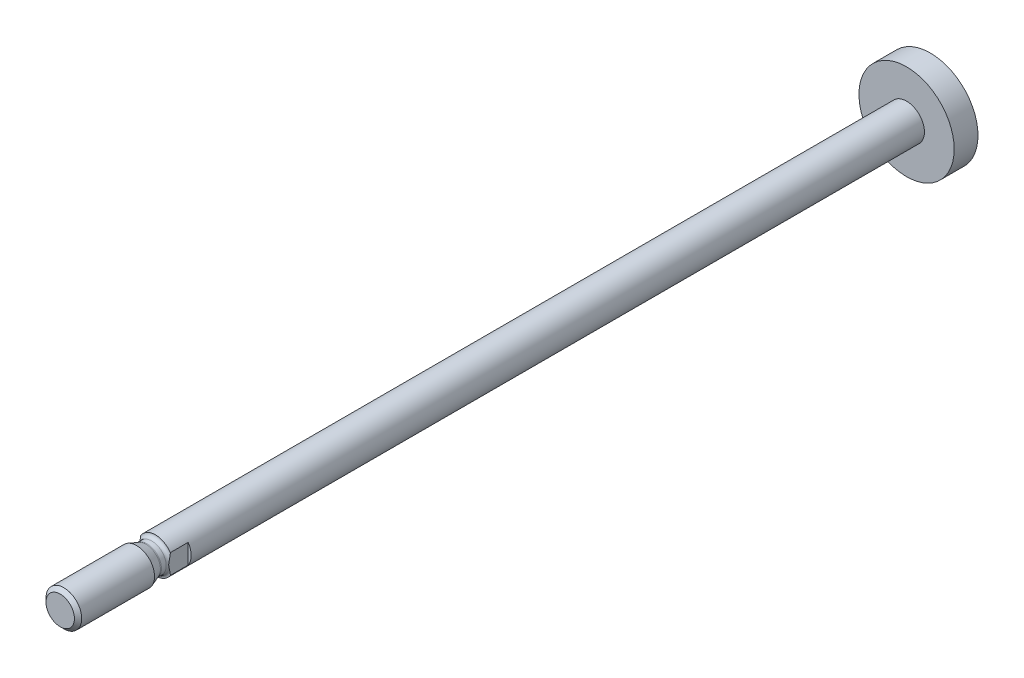
ISO-10303-21;
HEADER;
FILE_DESCRIPTION(('STEP AP214'),'2;1');
FILE_NAME('part.step','',(''),(''),'','','');
FILE_SCHEMA(('AUTOMOTIVE_DESIGN { 1 0 10303 214 1 1 1 1 }'));
ENDSEC;
DATA;
#1=APPLICATION_CONTEXT('core data for automotive mechanical design processes');
#2=APPLICATION_PROTOCOL_DEFINITION('international standard','automotive_design',2000,#1);
#3=PRODUCT_CONTEXT('',#1,'mechanical');
#4=PRODUCT('Part','Part','',(#3));
#5=PRODUCT_RELATED_PRODUCT_CATEGORY('part','',(#4));
#6=PRODUCT_DEFINITION_FORMATION('','',#4);
#7=PRODUCT_DEFINITION_CONTEXT('part definition',#1,'design');
#8=PRODUCT_DEFINITION('design','',#6,#7);
#9=PRODUCT_DEFINITION_SHAPE('','',#8);
#10=(LENGTH_UNIT() NAMED_UNIT(*) SI_UNIT(.MILLI.,.METRE.));
#11=(NAMED_UNIT(*) PLANE_ANGLE_UNIT() SI_UNIT($,.RADIAN.));
#12=(NAMED_UNIT(*) SI_UNIT($,.STERADIAN.) SOLID_ANGLE_UNIT());
#13=UNCERTAINTY_MEASURE_WITH_UNIT(LENGTH_MEASURE(1.E-05),#10,'distance_accuracy_value','');
#14=(GEOMETRIC_REPRESENTATION_CONTEXT(3) GLOBAL_UNCERTAINTY_ASSIGNED_CONTEXT((#13)) GLOBAL_UNIT_ASSIGNED_CONTEXT((#10,
#11,#12)) REPRESENTATION_CONTEXT('',''));
#15=CARTESIAN_POINT('',(0.,0.,0.));
#16=DIRECTION('',(0.,0.,1.));
#17=DIRECTION('',(1.,0.,0.));
#18=AXIS2_PLACEMENT_3D('',#15,#16,#17);
#19=CARTESIAN_POINT('',(0.,0.,-125.2));
#20=DIRECTION('',(0.,0.,1.));
#21=DIRECTION('',(1.,0.,0.));
#22=AXIS2_PLACEMENT_3D('',#19,#20,#21);
#23=CYLINDRICAL_SURFACE('',#22,3.);
#24=CARTESIAN_POINT('',(0.,0.,-121.2));
#25=DIRECTION('',(0.,0.,1.));
#26=DIRECTION('',(1.,0.,0.));
#27=AXIS2_PLACEMENT_3D('',#24,#25,#26);
#28=CIRCLE('',#27,3.);
#29=CARTESIAN_POINT('',(3.,0.,-121.2));
#30=VERTEX_POINT('',#29);
#31=EDGE_CURVE('E123',#30,#30,#28,.T.);
#32=ORIENTED_EDGE('',*,*,#31,.T.);
#33=EDGE_LOOP('',(#32));
#34=FACE_BOUND('',#33,.T.);
#35=DIRECTION('',(0.,0.,1.));
#36=VECTOR('',#35,1.);
#37=CARTESIAN_POINT('',(-2.5,-1.6583123951777,-125.2));
#38=LINE('',#37,#36);
#39=CARTESIAN_POINT('',(-2.5,-1.6583123951777,2.));
#40=VERTEX_POINT('',#39);
#41=CARTESIAN_POINT('',(-2.5,-1.6583123951777,5.));
#42=VERTEX_POINT('',#41);
#43=EDGE_CURVE('E53',#40,#42,#38,.T.);
#44=ORIENTED_EDGE('',*,*,#43,.F.);
#45=CARTESIAN_POINT('',(0.,0.,2.));
#46=DIRECTION('',(0.,0.,1.));
#47=DIRECTION('',(1.,0.,0.));
#48=AXIS2_PLACEMENT_3D('',#45,#46,#47);
#49=CIRCLE('',#48,3.);
#50=CARTESIAN_POINT('',(-2.5,1.6583123951777,2.));
#51=VERTEX_POINT('',#50);
#52=EDGE_CURVE('E11',#51,#40,#49,.T.);
#53=ORIENTED_EDGE('',*,*,#52,.F.);
#54=DIRECTION('',(0.,0.,1.));
#55=VECTOR('',#54,1.);
#56=CARTESIAN_POINT('',(-2.5,1.6583123951777,-125.2));
#57=LINE('',#56,#55);
#58=CARTESIAN_POINT('',(-2.5,1.65831239517778,4.99999999999909));
#59=VERTEX_POINT('',#58);
#60=EDGE_CURVE('E93',#59,#51,#57,.F.);
#61=ORIENTED_EDGE('',*,*,#60,.F.);
#62=CARTESIAN_POINT('',(0.,0.,5.));
#63=DIRECTION('',(0.,0.,1.));
#64=DIRECTION('',(1.,0.,0.));
#65=AXIS2_PLACEMENT_3D('',#62,#63,#64);
#66=CIRCLE('',#65,3.);
#67=CARTESIAN_POINT('',(2.5,1.6583123951777,5.));
#68=VERTEX_POINT('',#67);
#69=EDGE_CURVE('E92',#68,#59,#66,.T.);
#70=ORIENTED_EDGE('',*,*,#69,.F.);
#71=DIRECTION('',(0.,0.,1.));
#72=VECTOR('',#71,1.);
#73=CARTESIAN_POINT('',(2.5,1.6583123951777,-125.2));
#74=LINE('',#73,#72);
#75=CARTESIAN_POINT('',(2.5,1.6583123951777,2.));
#76=VERTEX_POINT('',#75);
#77=EDGE_CURVE('E61',#76,#68,#74,.T.);
#78=ORIENTED_EDGE('',*,*,#77,.F.);
#79=CARTESIAN_POINT('',(2.5,-1.6583123951777,2.));
#80=VERTEX_POINT('',#79);
#81=EDGE_CURVE('E42',#80,#76,#49,.T.);
#82=ORIENTED_EDGE('',*,*,#81,.F.);
#83=DIRECTION('',(0.,0.,1.));
#84=VECTOR('',#83,1.);
#85=CARTESIAN_POINT('',(2.5,-1.6583123951777,-125.2));
#86=LINE('',#85,#84);
#87=CARTESIAN_POINT('',(2.5,-1.65831239517778,4.99999999999909));
#88=VERTEX_POINT('',#87);
#89=EDGE_CURVE('E86',#88,#80,#86,.F.);
#90=ORIENTED_EDGE('',*,*,#89,.F.);
#91=EDGE_CURVE('E126',#42,#88,#66,.T.);
#92=ORIENTED_EDGE('',*,*,#91,.F.);
#93=EDGE_LOOP('',(#44,#53,#61,#70,#78,#82,#90,#92));
#94=FACE_BOUND('',#93,.T.);
#95=ADVANCED_FACE('F39',(#34,#94),#23,.T.);
#96=CARTESIAN_POINT('',(0.,0.,5.6000000000001));
#97=DIRECTION('',(0.,0.,1.));
#98=DIRECTION('',(1.,0.,0.));
#99=AXIS2_PLACEMENT_3D('',#96,#97,#98);
#100=TOROIDAL_SURFACE('',#99,3.0000000000001,0.600000000000099);
#101=CARTESIAN_POINT('',(0.,0.,5.6));
#102=DIRECTION('',(0.,0.,1.));
#103=DIRECTION('',(1.,0.,0.));
#104=AXIS2_PLACEMENT_3D('',#101,#102,#103);
#105=CIRCLE('',#104,2.4);
#106=CARTESIAN_POINT('',(2.4,0.,5.6));
#107=VERTEX_POINT('',#106);
#108=EDGE_CURVE('E114',#107,#107,#105,.T.);
#109=ORIENTED_EDGE('',*,*,#108,.F.);
#110=EDGE_LOOP('',(#109));
#111=FACE_BOUND('',#110,.T.);
#112=CARTESIAN_POINT('',(-2.5,0.,5.26833752096453));
#113=CARTESIAN_POINT('',(-2.5,0.0507234426297441,5.26834839993848));
#114=CARTESIAN_POINT('',(-2.5,0.101441776799662,5.26596843791489));
#115=CARTESIAN_POINT('',(-2.5,0.202536067556288,5.2569952015163));
#116=CARTESIAN_POINT('',(-2.5,0.252911588949165,5.2503973212644));
#117=CARTESIAN_POINT('',(-2.5,0.35392632203634,5.23403658213965));
#118=CARTESIAN_POINT('',(-2.5,0.404557369480025,5.224225913585));
#119=CARTESIAN_POINT('',(-2.5,0.505400398866161,5.20278595137819));
#120=CARTESIAN_POINT('',(-2.5,0.555612509775304,5.1911572409283));
#121=CARTESIAN_POINT('',(-2.5,0.655655613826413,5.16721678219831));
#122=CARTESIAN_POINT('',(-2.5,0.705487327239528,5.15490798008948));
#123=CARTESIAN_POINT('',(-2.5,0.805181864056362,5.13041893752706));
#124=CARTESIAN_POINT('',(-2.5,0.855044688832192,5.11823870324147));
#125=CARTESIAN_POINT('',(-2.5,1.00507376125951,5.08293674920261));
#126=CARTESIAN_POINT('',(-2.5,1.1055660279648,5.06108488117838));
#127=CARTESIAN_POINT('',(-2.5,1.30645493621981,5.02592717471424));
#128=CARTESIAN_POINT('',(-2.5,1.40682678389803,5.01248870030289));
#129=CARTESIAN_POINT('',(-2.5,1.60840199518987,4.99838763017595));
#130=CARTESIAN_POINT('',(-2.5,1.70960094347028,4.99767823287719));
#131=CARTESIAN_POINT('',(-2.5,1.86622781794818,5.01106448653587));
#132=CARTESIAN_POINT('',(-2.5,1.92218137883188,5.01877622049858));
#133=CARTESIAN_POINT('',(-2.5,2.03285053262341,5.0413651074687));
#134=CARTESIAN_POINT('',(-2.5,2.08756307823151,5.05625824117348));
#135=CARTESIAN_POINT('',(-2.5,2.18328084843635,5.09083457513036));
#136=CARTESIAN_POINT('',(-2.5,2.22483950461237,5.10896465354793));
#137=CARTESIAN_POINT('',(-2.5,2.30459524648064,5.1515245306446));
#138=CARTESIAN_POINT('',(-2.5,2.34279989724468,5.17593963670877));
#139=CARTESIAN_POINT('',(-2.5,2.40362753966407,5.22361594487622));
#140=CARTESIAN_POINT('',(-2.5,2.42757076392253,5.24518752529637));
#141=CARTESIAN_POINT('',(-2.5,2.47175757689057,5.29185573262645));
#142=CARTESIAN_POINT('',(-2.5,2.49200531158724,5.31694835263777));
#143=CARTESIAN_POINT('',(-2.5,2.52468492158815,5.36594738678137));
#144=CARTESIAN_POINT('',(-2.5,2.53785643218482,5.38935828111803));
#145=CARTESIAN_POINT('',(-2.5,2.56013164913301,5.43805384411947));
#146=CARTESIAN_POINT('',(-2.5,2.56923737677398,5.46333757440499));
#147=CARTESIAN_POINT('',(-2.5,2.58283057049981,5.51527496834575));
#148=CARTESIAN_POINT('',(-2.5,2.58729356105886,5.54193512227162));
#149=CARTESIAN_POINT('',(-2.5,2.59118020467599,5.59561989324821));
#150=CARTESIAN_POINT('',(-2.5,2.5906054179438,5.62264439487102));
#151=CARTESIAN_POINT('',(-2.5,2.5847447911938,5.67371298536964));
#152=CARTESIAN_POINT('',(-2.5,2.57988467167735,5.69780754958458));
#153=CARTESIAN_POINT('',(-2.5,2.56633022368149,5.74488485425705));
#154=CARTESIAN_POINT('',(-2.5,2.55763543991684,5.76786746233366));
#155=CARTESIAN_POINT('',(-2.5,2.53647695281551,5.81308697753744));
#156=CARTESIAN_POINT('',(-2.5,2.52388217742275,5.83526203314746));
#157=CARTESIAN_POINT('',(-2.5,2.49565831542702,5.87756858678122));
#158=CARTESIAN_POINT('',(-2.5,2.4800283022487,5.897699457906));
#159=CARTESIAN_POINT('',(-2.5,2.4381803160609,5.94494905141413));
#160=CARTESIAN_POINT('',(-2.5,2.41048793322772,5.97076525046522));
#161=CARTESIAN_POINT('',(-2.5,2.35128940318857,6.01762864695372));
#162=CARTESIAN_POINT('',(-2.5,2.31977194494069,6.03866114436212));
#163=CARTESIAN_POINT('',(-2.5,2.23952256294481,6.08463351159361));
#164=CARTESIAN_POINT('',(-2.5,2.18939204577726,6.10711912432076));
#165=CARTESIAN_POINT('',(-2.5,2.086424206848,6.14398267826286));
#166=CARTESIAN_POINT('',(-2.5,2.03358928965091,6.15836768991921));
#167=CARTESIAN_POINT('',(-2.5,1.93599580204544,6.17849484994285));
#168=CARTESIAN_POINT('',(-2.5,1.89144834077192,6.18531116329585));
#169=CARTESIAN_POINT('',(-2.5,1.80189908033616,6.19505697557448));
#170=CARTESIAN_POINT('',(-2.5,1.75689686177072,6.19798247787778));
#171=CARTESIAN_POINT('',(-2.5,1.66646832286127,6.20053377831371));
#172=CARTESIAN_POINT('',(-2.5,1.6210413945456,6.20013412759755));
#173=CARTESIAN_POINT('',(-2.5,1.53034280767568,6.19650595241103));
#174=CARTESIAN_POINT('',(-2.5,1.48507106445849,6.1932793543307));
#175=CARTESIAN_POINT('',(-2.5,1.33918047559004,6.17906735223514));
#176=CARTESIAN_POINT('',(-2.5,1.23902345631669,6.16342028964884));
#177=CARTESIAN_POINT('',(-2.5,1.03994836030368,6.12508984420092));
#178=CARTESIAN_POINT('',(-2.5,0.941034235224376,6.10238806221333));
#179=CARTESIAN_POINT('',(-2.5,0.793509038998567,6.06677672186832));
#180=CARTESIAN_POINT('',(-2.5,0.7446863854637,6.054702575567));
#181=CARTESIAN_POINT('',(-2.5,0.646996290398524,6.030738686552));
#182=CARTESIAN_POINT('',(-2.5,0.598128851070118,6.0188489352388));
#183=CARTESIAN_POINT('',(-2.5,0.500334281886721,5.99617397742217));
#184=CARTESIAN_POINT('',(-2.5,0.451408146263369,5.98538460255591));
#185=CARTESIAN_POINT('',(-2.5,0.353119090508098,5.96594052833405));
#186=CARTESIAN_POINT('',(-2.5,0.303756196305667,5.95728570312374));
#187=CARTESIAN_POINT('',(-2.5,0.204122497966492,5.94328110899502));
#188=CARTESIAN_POINT('',(-2.5,0.153847567097064,5.93795905985694));
#189=CARTESIAN_POINT('',(-2.5,0.0530351286873156,5.93177082830429));
#190=CARTESIAN_POINT('',(-2.5,0.0024977994589948,5.930901937583));
#191=CARTESIAN_POINT('',(-2.5,-0.0985305210715612,5.93381110626722));
#192=CARTESIAN_POINT('',(-2.5,-0.14902123482016,5.93759813511376));
#193=CARTESIAN_POINT('',(-2.5,-0.249573888409545,5.94904126176878));
#194=CARTESIAN_POINT('',(-2.5,-0.299635458091892,5.95670041313862));
#195=CARTESIAN_POINT('',(-2.5,-0.399725252919972,5.97472154484855));
#196=CARTESIAN_POINT('',(-2.5,-0.449748880216866,5.98510788708088));
#197=CARTESIAN_POINT('',(-2.5,-0.549453617514231,6.00732659888942));
#198=CARTESIAN_POINT('',(-2.5,-0.599134785603654,6.01915871651809));
#199=CARTESIAN_POINT('',(-2.5,-0.698392421521691,6.04328051823731));
#200=CARTESIAN_POINT('',(-2.5,-0.747968869022546,6.05557028383309));
#201=CARTESIAN_POINT('',(-2.5,-0.84720464589227,6.07981009984425));
#202=CARTESIAN_POINT('',(-2.5,-0.896863971124109,6.0917601667094));
#203=CARTESIAN_POINT('',(-2.5,-0.975241469303783,6.10978478042876));
#204=CARTESIAN_POINT('',(-2.5,-1.00388150216564,6.11619624816889));
#205=CARTESIAN_POINT('',(-2.5,-1.06125902675178,6.12857195456169));
#206=CARTESIAN_POINT('',(-2.5,-1.08999652018277,6.13453618533974));
#207=CARTESIAN_POINT('',(-2.5,-1.14748265723325,6.1458846074232));
#208=CARTESIAN_POINT('',(-2.5,-1.17623091126653,6.15127075206469));
#209=CARTESIAN_POINT('',(-2.5,-1.23384312688132,6.16137594760793));
#210=CARTESIAN_POINT('',(-2.5,-1.26270708577413,6.16609501391968));
#211=CARTESIAN_POINT('',(-2.5,-1.34949136584038,6.17908804539659));
#212=CARTESIAN_POINT('',(-2.5,-1.40759592627029,6.18619616796949));
#213=CARTESIAN_POINT('',(-2.5,-1.52420669712544,6.19636423685649));
#214=CARTESIAN_POINT('',(-2.5,-1.58271310503325,6.1994220245478));
#215=CARTESIAN_POINT('',(-2.5,-1.70911532678372,6.20051114496721));
#216=CARTESIAN_POINT('',(-2.5,-1.77702602049488,6.19766666103081));
#217=CARTESIAN_POINT('',(-2.5,-1.912149147007,6.18315262249392));
#218=CARTESIAN_POINT('',(-2.5,-1.97936016975703,6.17146782027944));
#219=CARTESIAN_POINT('',(-2.5,-2.09293467910467,6.14162835403314));
#220=CARTESIAN_POINT('',(-2.5,-2.1399801193776,6.12611102431254));
#221=CARTESIAN_POINT('',(-2.5,-2.23116163556241,6.08815370009842));
#222=CARTESIAN_POINT('',(-2.5,-2.27530548479003,6.06573319994486));
#223=CARTESIAN_POINT('',(-2.5,-2.34660579555824,6.0206656653127));
#224=CARTESIAN_POINT('',(-2.5,-2.37498330055351,5.99995880382842));
#225=CARTESIAN_POINT('',(-2.5,-2.42818185419372,5.95435228802646));
#226=CARTESIAN_POINT('',(-2.5,-2.45300628498281,5.92945667074117));
#227=CARTESIAN_POINT('',(-2.5,-2.49337206402375,5.88080957286876));
#228=CARTESIAN_POINT('',(-2.5,-2.50977972671913,5.85778028891266));
#229=CARTESIAN_POINT('',(-2.5,-2.5385948801776,5.80932543735906));
#230=CARTESIAN_POINT('',(-2.5,-2.55100468980703,5.7839012699618));
#231=CARTESIAN_POINT('',(-2.5,-2.57111606880391,5.7310152189761));
#232=CARTESIAN_POINT('',(-2.5,-2.57878240755407,5.70353974708557));
#233=CARTESIAN_POINT('',(-2.5,-2.58865812747843,5.64762323062993));
#234=CARTESIAN_POINT('',(-2.5,-2.59087093912576,5.61918280447873));
#235=CARTESIAN_POINT('',(-2.5,-2.58974032110845,5.56589468768046));
#236=CARTESIAN_POINT('',(-2.5,-2.58704036062141,5.54103102121321));
#237=CARTESIAN_POINT('',(-2.5,-2.57748265423562,5.49212434637714));
#238=CARTESIAN_POINT('',(-2.5,-2.57062518368025,5.46808128377277));
#239=CARTESIAN_POINT('',(-2.5,-2.55318309970271,5.42147694109437));
#240=CARTESIAN_POINT('',(-2.5,-2.54260847384664,5.39891188066154));
#241=CARTESIAN_POINT('',(-2.5,-2.51826231502416,5.35558968714916));
#242=CARTESIAN_POINT('',(-2.5,-2.50448933519591,5.33483337816906));
#243=CARTESIAN_POINT('',(-2.5,-2.46797257111134,5.28708275256527));
#244=CARTESIAN_POINT('',(-2.5,-2.44388663659998,5.26111270404154));
#245=CARTESIAN_POINT('',(-2.5,-2.39183121173732,5.21341702762138));
#246=CARTESIAN_POINT('',(-2.5,-2.36385414462067,5.19169988455002));
#247=CARTESIAN_POINT('',(-2.5,-2.29309604385226,5.14424955817408));
#248=CARTESIAN_POINT('',(-2.5,-2.24896151787955,5.12054273771195));
#249=CARTESIAN_POINT('',(-2.5,-2.15755724893995,5.08032986787273));
#250=CARTESIAN_POINT('',(-2.5,-2.1102815253453,5.0638380357592));
#251=CARTESIAN_POINT('',(-2.5,-1.98539576167196,5.02901994971649));
#252=CARTESIAN_POINT('',(-2.5,-1.90647682078743,5.01544295171964));
#253=CARTESIAN_POINT('',(-2.5,-1.74768813149434,5.00017484346382));
#254=CARTESIAN_POINT('',(-2.5,-1.66781762927049,4.99849388464395));
#255=CARTESIAN_POINT('',(-2.5,-1.45429321635247,5.00579419289827));
#256=CARTESIAN_POINT('',(-2.5,-1.32097329964418,5.02279704607492));
#257=CARTESIAN_POINT('',(-2.5,-1.12273292987174,5.05843900515103));
#258=CARTESIAN_POINT('',(-2.5,-1.05669317759064,5.07208123732001));
#259=CARTESIAN_POINT('',(-2.5,-0.925080173294097,5.10144856377507));
#260=CARTESIAN_POINT('',(-2.5,-0.85950678696237,5.11717303045709));
#261=CARTESIAN_POINT('',(-2.5,-0.728157455724953,5.14928145287764));
#262=CARTESIAN_POINT('',(-2.5,-0.662382356378558,5.16566853749943));
#263=CARTESIAN_POINT('',(-2.5,-0.530451230737349,5.19710748690057));
#264=CARTESIAN_POINT('',(-2.5,-0.46429498692756,5.21215848739435));
#265=CARTESIAN_POINT('',(-2.5,-0.332137198799993,5.23811298682939));
#266=CARTESIAN_POINT('',(-2.5,-0.266147995614798,5.24907485812429));
#267=CARTESIAN_POINT('',(-2.5,-0.13343508853748,5.26417313941374));
#268=CARTESIAN_POINT('',(-2.5,-0.0667131258677896,5.26832321258322));
#269=CARTESIAN_POINT('',(-2.5,0.,5.26833752096453));
#270=B_SPLINE_CURVE_WITH_KNOTS('',3,(#112,#113,#114,#115,#116,#117,#118,#119,#120,#121,#122,
#123,#124,#125,#126,#127,#128,#129,#130,#131,#132,#133,#134,#135,#136,#137,#138,#139,#140,#141,
#142,#143,#144,#145,#146,#147,#148,#149,#150,#151,#152,#153,#154,#155,#156,#157,#158,#159,#160,
#161,#162,#163,#164,#165,#166,#167,#168,#169,#170,#171,#172,#173,#174,#175,#176,#177,#178,#179,
#180,#181,#182,#183,#184,#185,#186,#187,#188,#189,#190,#191,#192,#193,#194,#195,#196,#197,#198,
#199,#200,#201,#202,#203,#204,#205,#206,#207,#208,#209,#210,#211,#212,#213,#214,#215,#216,#217,
#218,#219,#220,#221,#222,#223,#224,#225,#226,#227,#228,#229,#230,#231,#232,#233,#234,#235,#236,
#237,#238,#239,#240,#241,#242,#243,#244,#245,#246,#247,#248,#249,#250,#251,#252,#253,#254,#255,
#256,#257,#258,#259,#260,#261,#262,#263,#264,#265,#266,#267,#268,#269),.UNSPECIFIED.,.T.,.F.,(4,
2,2,2,2,2,2,2,2,2,2,2,2,2,2,2,2,2,2,2,2,2,2,2,2,2,2,2,2,2,2,2,2,2,2,2,2,2,2,2,2,2,2,2,2,2,2,2,2,
2,2,2,2,2,2,2,2,2,2,2,2,2,2,2,2,2,2,2,2,2,2,2,2,2,2,2,2,2,4),(0.,0.152115749462961,
0.304397890479205,0.459057777660119,0.613668153537359,0.76765452052503,0.921648241698668,
1.22999186740174,1.53334327295527,1.83557910296654,2.00468122496769,2.17416139710525,
2.30975526259906,2.44503498191611,2.54138706790922,2.63763038250484,2.71788414225495,
2.79809795959123,2.87873253660465,2.95934214181033,3.03274594433316,3.10615846435156,
3.18237030946167,3.25860545664829,3.37154774885102,3.48483255287211,3.64874326809032,
3.81251069461259,3.94751849926572,4.08266487644991,4.21884653384819,4.35493546397263,
4.65852821936571,4.96291950372185,5.11380283698696,5.2646791123006,5.41496078164642,
5.56523358814694,5.71674021710462,5.86815469233289,6.01986131905259,6.17168776888823,
6.3249195654772,6.47812469716163,6.63135724578266,6.7845823615018,6.87262624262423,
6.9606716735928,7.04840955727845,7.13614541382411,7.31164210225534,7.487232283928,
7.69072100095721,7.89456149389004,8.04275027379228,8.1905243529531,8.29556794817655,
8.40051087855684,8.48500651711341,8.56945305722983,8.65451949621374,8.73953241154295,
8.81419843639983,8.88885951681877,8.96332150589878,9.03781724571823,9.14348655987521,
9.24936459025057,9.39882327642183,9.54857516145059,9.78744806917548,10.0265247936209,
10.4280628477144,10.630387719692,10.8326517473681,11.0360188284461,11.239516519211,
11.439986712254,11.6400543065313),.UNSPECIFIED.);
#271=EDGE_CURVE('E84',#42,#59,#270,.T.);
#272=ORIENTED_EDGE('',*,*,#271,.F.);
#273=ORIENTED_EDGE('',*,*,#91,.T.);
#274=CARTESIAN_POINT('',(2.5,0.,5.26833752096453));
#275=CARTESIAN_POINT('',(2.5,-0.0507234426297441,5.26834839993848));
#276=CARTESIAN_POINT('',(2.5,-0.101441776799662,5.26596843791489));
#277=CARTESIAN_POINT('',(2.5,-0.202536067556288,5.2569952015163));
#278=CARTESIAN_POINT('',(2.5,-0.252911588949165,5.2503973212644));
#279=CARTESIAN_POINT('',(2.5,-0.35392632203634,5.23403658213965));
#280=CARTESIAN_POINT('',(2.5,-0.404557369480025,5.224225913585));
#281=CARTESIAN_POINT('',(2.5,-0.505400398866161,5.20278595137819));
#282=CARTESIAN_POINT('',(2.5,-0.555612509775304,5.1911572409283));
#283=CARTESIAN_POINT('',(2.5,-0.655655613826413,5.16721678219831));
#284=CARTESIAN_POINT('',(2.5,-0.705487327239528,5.15490798008948));
#285=CARTESIAN_POINT('',(2.5,-0.805181864056362,5.13041893752706));
#286=CARTESIAN_POINT('',(2.5,-0.855044688832192,5.11823870324147));
#287=CARTESIAN_POINT('',(2.5,-1.00507376125951,5.08293674920261));
#288=CARTESIAN_POINT('',(2.5,-1.1055660279648,5.06108488117838));
#289=CARTESIAN_POINT('',(2.5,-1.30645493621981,5.02592717471424));
#290=CARTESIAN_POINT('',(2.5,-1.40682678389803,5.01248870030289));
#291=CARTESIAN_POINT('',(2.5,-1.60840199518987,4.99838763017595));
#292=CARTESIAN_POINT('',(2.5,-1.70960094347028,4.99767823287719));
#293=CARTESIAN_POINT('',(2.5,-1.86622781794818,5.01106448653587));
#294=CARTESIAN_POINT('',(2.5,-1.92218137883188,5.01877622049858));
#295=CARTESIAN_POINT('',(2.5,-2.03285053262341,5.0413651074687));
#296=CARTESIAN_POINT('',(2.5,-2.08756307823151,5.05625824117348));
#297=CARTESIAN_POINT('',(2.5,-2.18328084843635,5.09083457513036));
#298=CARTESIAN_POINT('',(2.5,-2.22483950461237,5.10896465354793));
#299=CARTESIAN_POINT('',(2.5,-2.30459524648064,5.1515245306446));
#300=CARTESIAN_POINT('',(2.5,-2.34279989724468,5.17593963670877));
#301=CARTESIAN_POINT('',(2.5,-2.40362753966407,5.22361594487622));
#302=CARTESIAN_POINT('',(2.5,-2.42757076392253,5.24518752529637));
#303=CARTESIAN_POINT('',(2.5,-2.47175757689057,5.29185573262645));
#304=CARTESIAN_POINT('',(2.5,-2.49200531158724,5.31694835263777));
#305=CARTESIAN_POINT('',(2.5,-2.52468492158815,5.36594738678137));
#306=CARTESIAN_POINT('',(2.5,-2.53785643218482,5.38935828111803));
#307=CARTESIAN_POINT('',(2.5,-2.56013164913301,5.43805384411947));
#308=CARTESIAN_POINT('',(2.5,-2.56923737677398,5.46333757440499));
#309=CARTESIAN_POINT('',(2.5,-2.58283057049981,5.51527496834575));
#310=CARTESIAN_POINT('',(2.5,-2.58729356105886,5.54193512227162));
#311=CARTESIAN_POINT('',(2.5,-2.59118020467599,5.59561989324821));
#312=CARTESIAN_POINT('',(2.5,-2.5906054179438,5.62264439487102));
#313=CARTESIAN_POINT('',(2.5,-2.5847447911938,5.67371298536964));
#314=CARTESIAN_POINT('',(2.5,-2.57988467167735,5.69780754958458));
#315=CARTESIAN_POINT('',(2.5,-2.56633022368149,5.74488485425705));
#316=CARTESIAN_POINT('',(2.5,-2.55763543991684,5.76786746233366));
#317=CARTESIAN_POINT('',(2.5,-2.53647695281551,5.81308697753744));
#318=CARTESIAN_POINT('',(2.5,-2.52388217742275,5.83526203314746));
#319=CARTESIAN_POINT('',(2.5,-2.49565831542702,5.87756858678122));
#320=CARTESIAN_POINT('',(2.5,-2.4800283022487,5.897699457906));
#321=CARTESIAN_POINT('',(2.5,-2.4381803160609,5.94494905141413));
#322=CARTESIAN_POINT('',(2.5,-2.41048793322772,5.97076525046522));
#323=CARTESIAN_POINT('',(2.5,-2.35128940318857,6.01762864695372));
#324=CARTESIAN_POINT('',(2.5,-2.31977194494069,6.03866114436212));
#325=CARTESIAN_POINT('',(2.5,-2.23952256294481,6.08463351159361));
#326=CARTESIAN_POINT('',(2.5,-2.18939204577726,6.10711912432076));
#327=CARTESIAN_POINT('',(2.5,-2.086424206848,6.14398267826286));
#328=CARTESIAN_POINT('',(2.5,-2.03358928965091,6.15836768991921));
#329=CARTESIAN_POINT('',(2.5,-1.93599580204544,6.17849484994285));
#330=CARTESIAN_POINT('',(2.5,-1.89144834077192,6.18531116329585));
#331=CARTESIAN_POINT('',(2.5,-1.80189908033616,6.19505697557448));
#332=CARTESIAN_POINT('',(2.5,-1.75689686177072,6.19798247787778));
#333=CARTESIAN_POINT('',(2.5,-1.66646832286127,6.20053377831371));
#334=CARTESIAN_POINT('',(2.5,-1.6210413945456,6.20013412759755));
#335=CARTESIAN_POINT('',(2.5,-1.53034280767568,6.19650595241103));
#336=CARTESIAN_POINT('',(2.5,-1.48507106445849,6.1932793543307));
#337=CARTESIAN_POINT('',(2.5,-1.33918047559004,6.17906735223514));
#338=CARTESIAN_POINT('',(2.5,-1.23902345631669,6.16342028964884));
#339=CARTESIAN_POINT('',(2.5,-1.03994836030368,6.12508984420092));
#340=CARTESIAN_POINT('',(2.5,-0.941034235224376,6.10238806221333));
#341=CARTESIAN_POINT('',(2.5,-0.793509038998567,6.06677672186832));
#342=CARTESIAN_POINT('',(2.5,-0.7446863854637,6.054702575567));
#343=CARTESIAN_POINT('',(2.5,-0.646996290398524,6.030738686552));
#344=CARTESIAN_POINT('',(2.5,-0.598128851070118,6.0188489352388));
#345=CARTESIAN_POINT('',(2.5,-0.500334281886721,5.99617397742217));
#346=CARTESIAN_POINT('',(2.5,-0.451408146263369,5.98538460255591));
#347=CARTESIAN_POINT('',(2.5,-0.353119090508098,5.96594052833405));
#348=CARTESIAN_POINT('',(2.5,-0.303756196305667,5.95728570312374));
#349=CARTESIAN_POINT('',(2.5,-0.204122497966492,5.94328110899502));
#350=CARTESIAN_POINT('',(2.5,-0.153847567097064,5.93795905985694));
#351=CARTESIAN_POINT('',(2.5,-0.0530351286873156,5.93177082830429));
#352=CARTESIAN_POINT('',(2.5,-0.0024977994589948,5.930901937583));
#353=CARTESIAN_POINT('',(2.5,0.0985305210715612,5.93381110626722));
#354=CARTESIAN_POINT('',(2.5,0.14902123482016,5.93759813511376));
#355=CARTESIAN_POINT('',(2.5,0.249573888409545,5.94904126176878));
#356=CARTESIAN_POINT('',(2.5,0.299635458091892,5.95670041313862));
#357=CARTESIAN_POINT('',(2.5,0.399725252919972,5.97472154484855));
#358=CARTESIAN_POINT('',(2.5,0.449748880216866,5.98510788708088));
#359=CARTESIAN_POINT('',(2.5,0.549453617514231,6.00732659888942));
#360=CARTESIAN_POINT('',(2.5,0.599134785603654,6.01915871651809));
#361=CARTESIAN_POINT('',(2.5,0.698392421521691,6.04328051823731));
#362=CARTESIAN_POINT('',(2.5,0.747968869022546,6.05557028383309));
#363=CARTESIAN_POINT('',(2.5,0.84720464589227,6.07981009984425));
#364=CARTESIAN_POINT('',(2.5,0.896863971124109,6.0917601667094));
#365=CARTESIAN_POINT('',(2.5,0.975241469303783,6.10978478042876));
#366=CARTESIAN_POINT('',(2.5,1.00388150216564,6.11619624816889));
#367=CARTESIAN_POINT('',(2.5,1.06125902675178,6.12857195456169));
#368=CARTESIAN_POINT('',(2.5,1.08999652018277,6.13453618533974));
#369=CARTESIAN_POINT('',(2.5,1.14748265723325,6.1458846074232));
#370=CARTESIAN_POINT('',(2.5,1.17623091126653,6.15127075206469));
#371=CARTESIAN_POINT('',(2.5,1.23384312688132,6.16137594760793));
#372=CARTESIAN_POINT('',(2.5,1.26270708577413,6.16609501391968));
#373=CARTESIAN_POINT('',(2.5,1.34949136584038,6.17908804539659));
#374=CARTESIAN_POINT('',(2.5,1.40759592627029,6.18619616796949));
#375=CARTESIAN_POINT('',(2.5,1.52420669712544,6.19636423685649));
#376=CARTESIAN_POINT('',(2.5,1.58271310503325,6.1994220245478));
#377=CARTESIAN_POINT('',(2.5,1.70911532678372,6.20051114496721));
#378=CARTESIAN_POINT('',(2.5,1.77702602049488,6.19766666103081));
#379=CARTESIAN_POINT('',(2.5,1.912149147007,6.18315262249392));
#380=CARTESIAN_POINT('',(2.5,1.97936016975703,6.17146782027944));
#381=CARTESIAN_POINT('',(2.5,2.09293467910467,6.14162835403314));
#382=CARTESIAN_POINT('',(2.5,2.1399801193776,6.12611102431254));
#383=CARTESIAN_POINT('',(2.5,2.23116163556241,6.08815370009842));
#384=CARTESIAN_POINT('',(2.5,2.27530548479003,6.06573319994486));
#385=CARTESIAN_POINT('',(2.5,2.34660579555824,6.0206656653127));
#386=CARTESIAN_POINT('',(2.5,2.37498330055351,5.99995880382842));
#387=CARTESIAN_POINT('',(2.5,2.42818185419372,5.95435228802646));
#388=CARTESIAN_POINT('',(2.5,2.45300628498281,5.92945667074117));
#389=CARTESIAN_POINT('',(2.5,2.49337206402375,5.88080957286876));
#390=CARTESIAN_POINT('',(2.5,2.50977972671913,5.85778028891266));
#391=CARTESIAN_POINT('',(2.5,2.5385948801776,5.80932543735906));
#392=CARTESIAN_POINT('',(2.5,2.55100468980703,5.7839012699618));
#393=CARTESIAN_POINT('',(2.5,2.57111606880391,5.7310152189761));
#394=CARTESIAN_POINT('',(2.5,2.57878240755407,5.70353974708557));
#395=CARTESIAN_POINT('',(2.5,2.58865812747843,5.64762323062993));
#396=CARTESIAN_POINT('',(2.5,2.59087093912576,5.61918280447873));
#397=CARTESIAN_POINT('',(2.5,2.58974032110845,5.56589468768046));
#398=CARTESIAN_POINT('',(2.5,2.58704036062141,5.54103102121321));
#399=CARTESIAN_POINT('',(2.5,2.57748265423562,5.49212434637714));
#400=CARTESIAN_POINT('',(2.5,2.57062518368025,5.46808128377277));
#401=CARTESIAN_POINT('',(2.5,2.55318309970271,5.42147694109437));
#402=CARTESIAN_POINT('',(2.5,2.54260847384664,5.39891188066154));
#403=CARTESIAN_POINT('',(2.5,2.51826231502416,5.35558968714916));
#404=CARTESIAN_POINT('',(2.5,2.50448933519591,5.33483337816906));
#405=CARTESIAN_POINT('',(2.5,2.46797257111134,5.28708275256527));
#406=CARTESIAN_POINT('',(2.5,2.44388663659998,5.26111270404154));
#407=CARTESIAN_POINT('',(2.5,2.39183121173732,5.21341702762138));
#408=CARTESIAN_POINT('',(2.5,2.36385414462067,5.19169988455002));
#409=CARTESIAN_POINT('',(2.5,2.29309604385226,5.14424955817408));
#410=CARTESIAN_POINT('',(2.5,2.24896151787955,5.12054273771195));
#411=CARTESIAN_POINT('',(2.5,2.15755724893995,5.08032986787273));
#412=CARTESIAN_POINT('',(2.5,2.1102815253453,5.0638380357592));
#413=CARTESIAN_POINT('',(2.5,1.98539576167196,5.02901994971649));
#414=CARTESIAN_POINT('',(2.5,1.90647682078743,5.01544295171964));
#415=CARTESIAN_POINT('',(2.5,1.74768813149434,5.00017484346382));
#416=CARTESIAN_POINT('',(2.5,1.66781762927049,4.99849388464395));
#417=CARTESIAN_POINT('',(2.5,1.45429321635247,5.00579419289827));
#418=CARTESIAN_POINT('',(2.5,1.32097329964418,5.02279704607492));
#419=CARTESIAN_POINT('',(2.5,1.12273292987174,5.05843900515103));
#420=CARTESIAN_POINT('',(2.5,1.05669317759064,5.07208123732001));
#421=CARTESIAN_POINT('',(2.5,0.925080173294097,5.10144856377507));
#422=CARTESIAN_POINT('',(2.5,0.85950678696237,5.11717303045709));
#423=CARTESIAN_POINT('',(2.5,0.728157455724953,5.14928145287764));
#424=CARTESIAN_POINT('',(2.5,0.662382356378558,5.16566853749943));
#425=CARTESIAN_POINT('',(2.5,0.530451230737349,5.19710748690057));
#426=CARTESIAN_POINT('',(2.5,0.46429498692756,5.21215848739435));
#427=CARTESIAN_POINT('',(2.5,0.332137198799993,5.23811298682939));
#428=CARTESIAN_POINT('',(2.5,0.266147995614798,5.24907485812429));
#429=CARTESIAN_POINT('',(2.5,0.13343508853748,5.26417313941374));
#430=CARTESIAN_POINT('',(2.5,0.0667131258677896,5.26832321258322));
#431=CARTESIAN_POINT('',(2.5,0.,5.26833752096453));
#432=B_SPLINE_CURVE_WITH_KNOTS('',3,(#274,#275,#276,#277,#278,#279,#280,#281,#282,#283,#284,
#285,#286,#287,#288,#289,#290,#291,#292,#293,#294,#295,#296,#297,#298,#299,#300,#301,#302,#303,
#304,#305,#306,#307,#308,#309,#310,#311,#312,#313,#314,#315,#316,#317,#318,#319,#320,#321,#322,
#323,#324,#325,#326,#327,#328,#329,#330,#331,#332,#333,#334,#335,#336,#337,#338,#339,#340,#341,
#342,#343,#344,#345,#346,#347,#348,#349,#350,#351,#352,#353,#354,#355,#356,#357,#358,#359,#360,
#361,#362,#363,#364,#365,#366,#367,#368,#369,#370,#371,#372,#373,#374,#375,#376,#377,#378,#379,
#380,#381,#382,#383,#384,#385,#386,#387,#388,#389,#390,#391,#392,#393,#394,#395,#396,#397,#398,
#399,#400,#401,#402,#403,#404,#405,#406,#407,#408,#409,#410,#411,#412,#413,#414,#415,#416,#417,
#418,#419,#420,#421,#422,#423,#424,#425,#426,#427,#428,#429,#430,#431),.UNSPECIFIED.,.T.,.F.,(4,
2,2,2,2,2,2,2,2,2,2,2,2,2,2,2,2,2,2,2,2,2,2,2,2,2,2,2,2,2,2,2,2,2,2,2,2,2,2,2,2,2,2,2,2,2,2,2,2,
2,2,2,2,2,2,2,2,2,2,2,2,2,2,2,2,2,2,2,2,2,2,2,2,2,2,2,2,2,4),(0.,0.152115749462961,
0.304397890479205,0.459057777660119,0.613668153537359,0.76765452052503,0.921648241698668,
1.22999186740174,1.53334327295527,1.83557910296654,2.00468122496769,2.17416139710525,
2.30975526259906,2.44503498191611,2.54138706790922,2.63763038250484,2.71788414225495,
2.79809795959123,2.87873253660465,2.95934214181033,3.03274594433316,3.10615846435156,
3.18237030946167,3.25860545664829,3.37154774885102,3.48483255287211,3.64874326809032,
3.81251069461259,3.94751849926572,4.08266487644991,4.21884653384819,4.35493546397263,
4.65852821936571,4.96291950372185,5.11380283698696,5.2646791123006,5.41496078164642,
5.56523358814694,5.71674021710462,5.86815469233289,6.01986131905259,6.17168776888823,
6.3249195654772,6.47812469716163,6.63135724578266,6.7845823615018,6.87262624262423,
6.9606716735928,7.04840955727845,7.13614541382411,7.31164210225534,7.487232283928,
7.69072100095721,7.89456149389004,8.04275027379228,8.1905243529531,8.29556794817655,
8.40051087855684,8.48500651711341,8.56945305722983,8.65451949621374,8.73953241154295,
8.81419843639983,8.88885951681877,8.96332150589878,9.03781724571823,9.14348655987521,
9.24936459025057,9.39882327642183,9.54857516145059,9.78744806917548,10.0265247936209,
10.4280628477144,10.630387719692,10.8326517473681,11.0360188284461,11.239516519211,
11.439986712254,11.6400543065313),.UNSPECIFIED.);
#433=EDGE_CURVE('E128',#68,#88,#432,.T.);
#434=ORIENTED_EDGE('',*,*,#433,.F.);
#435=ORIENTED_EDGE('',*,*,#69,.T.);
#436=EDGE_LOOP('',(#272,#273,#434,#435));
#437=FACE_BOUND('',#436,.T.);
#438=ADVANCED_FACE('F138',(#111,#437),#100,.F.);
#439=CARTESIAN_POINT('',(0.,3.,-121.2));
#440=DIRECTION('',(0.,0.,-1.));
#441=DIRECTION('',(-1.,0.,0.));
#442=AXIS2_PLACEMENT_3D('',#439,#440,#441);
#443=PLANE('',#442);
#444=ORIENTED_EDGE('',*,*,#31,.F.);
#445=EDGE_LOOP('',(#444));
#446=FACE_BOUND('',#445,.T.);
#447=CARTESIAN_POINT('',(0.,0.,-121.2));
#448=DIRECTION('',(0.,0.,1.));
#449=DIRECTION('',(1.,0.,0.));
#450=AXIS2_PLACEMENT_3D('',#447,#448,#449);
#451=CIRCLE('',#450,8.);
#452=CARTESIAN_POINT('',(8.,0.,-121.2));
#453=VERTEX_POINT('',#452);
#454=EDGE_CURVE('E120',#453,#453,#451,.T.);
#455=ORIENTED_EDGE('',*,*,#454,.T.);
#456=EDGE_LOOP('',(#455));
#457=FACE_BOUND('',#456,.T.);
#458=ADVANCED_FACE('F185',(#446,#457),#443,.F.);
#459=CARTESIAN_POINT('',(0.,0.,-125.2));
#460=DIRECTION('',(0.,0.,1.));
#461=DIRECTION('',(1.,0.,0.));
#462=AXIS2_PLACEMENT_3D('',#459,#460,#461);
#463=CYLINDRICAL_SURFACE('',#462,8.);
#464=ORIENTED_EDGE('',*,*,#454,.F.);
#465=EDGE_LOOP('',(#464));
#466=FACE_BOUND('',#465,.T.);
#467=CARTESIAN_POINT('',(0.,0.,-125.2));
#468=DIRECTION('',(0.,0.,1.));
#469=DIRECTION('',(1.,0.,0.));
#470=AXIS2_PLACEMENT_3D('',#467,#468,#469);
#471=CIRCLE('',#470,8.);
#472=CARTESIAN_POINT('',(8.,0.,-125.2));
#473=VERTEX_POINT('',#472);
#474=EDGE_CURVE('E117',#473,#473,#471,.T.);
#475=ORIENTED_EDGE('',*,*,#474,.T.);
#476=EDGE_LOOP('',(#475));
#477=FACE_BOUND('',#476,.T.);
#478=ADVANCED_FACE('F176',(#466,#477),#463,.T.);
#479=CARTESIAN_POINT('',(0.,8.,-125.2));
#480=DIRECTION('',(0.,0.,1.));
#481=DIRECTION('',(1.,0.,0.));
#482=AXIS2_PLACEMENT_3D('',#479,#480,#481);
#483=PLANE('',#482);
#484=ORIENTED_EDGE('',*,*,#474,.F.);
#485=EDGE_LOOP('',(#484));
#486=FACE_BOUND('',#485,.T.);
#487=ADVANCED_FACE('F171',(#486),#483,.F.);
#488=CARTESIAN_POINT('',(0.,0.,4.));
#489=DIRECTION('',(0.,0.,1.));
#490=DIRECTION('',(1.,0.,0.));
#491=AXIS2_PLACEMENT_3D('',#488,#489,#490);
#492=CYLINDRICAL_SURFACE('',#491,2.4);
#493=CARTESIAN_POINT('',(0.,0.,6.3942038115749));
#494=DIRECTION('',(0.,0.,1.));
#495=DIRECTION('',(1.,0.,0.));
#496=AXIS2_PLACEMENT_3D('',#493,#494,#495);
#497=CIRCLE('',#496,2.4);
#498=CARTESIAN_POINT('',(2.4,0.,6.3942038115749));
#499=VERTEX_POINT('',#498);
#500=EDGE_CURVE('E111',#499,#499,#497,.T.);
#501=ORIENTED_EDGE('',*,*,#500,.F.);
#502=EDGE_LOOP('',(#501));
#503=FACE_BOUND('',#502,.T.);
#504=ORIENTED_EDGE('',*,*,#108,.T.);
#505=EDGE_LOOP('',(#504));
#506=FACE_BOUND('',#505,.T.);
#507=ADVANCED_FACE('F168',(#503,#506),#492,.T.);
#508=CARTESIAN_POINT('',(0.,0.,6.39420381157482));
#509=DIRECTION('',(0.,0.,1.));
#510=DIRECTION('',(1.,0.,0.));
#511=AXIS2_PLACEMENT_3D('',#508,#509,#510);
#512=TOROIDAL_SURFACE('',#511,2.99999999999972,0.599999999999719);
#513=CARTESIAN_POINT('',(0.,0.,6.5994158975703));
#514=DIRECTION('',(0.,0.,1.));
#515=DIRECTION('',(1.,0.,0.));
#516=AXIS2_PLACEMENT_3D('',#513,#514,#515);
#517=CIRCLE('',#516,2.4361844275285);
#518=CARTESIAN_POINT('',(2.4361844275285,0.,6.5994158975703));
#519=VERTEX_POINT('',#518);
#520=EDGE_CURVE('E108',#519,#519,#517,.T.);
#521=ORIENTED_EDGE('',*,*,#520,.F.);
#522=EDGE_LOOP('',(#521));
#523=FACE_BOUND('',#522,.T.);
#524=ORIENTED_EDGE('',*,*,#500,.T.);
#525=EDGE_LOOP('',(#524));
#526=FACE_BOUND('',#525,.T.);
#527=ADVANCED_FACE('F165',(#523,#526),#512,.F.);
#528=CARTESIAN_POINT('',(0.,0.,6.5994158975703));
#529=DIRECTION('',(0.,0.,1.));
#530=DIRECTION('',(1.,0.,0.));
#531=AXIS2_PLACEMENT_3D('',#528,#529,#530);
#532=CONICAL_SURFACE('',#531,2.4361844275285,0.34906585039883);
#533=CARTESIAN_POINT('',(0.,0.,8.1484864516728));
#534=DIRECTION('',(0.,0.,1.));
#535=DIRECTION('',(1.,0.,0.));
#536=AXIS2_PLACEMENT_3D('',#533,#534,#535);
#537=CIRCLE('',#536,3.);
#538=CARTESIAN_POINT('',(3.,0.,8.1484864516728));
#539=VERTEX_POINT('',#538);
#540=EDGE_CURVE('E105',#539,#539,#537,.T.);
#541=ORIENTED_EDGE('',*,*,#540,.F.);
#542=EDGE_LOOP('',(#541));
#543=FACE_BOUND('',#542,.T.);
#544=ORIENTED_EDGE('',*,*,#520,.T.);
#545=EDGE_LOOP('',(#544));
#546=FACE_BOUND('',#545,.T.);
#547=ADVANCED_FACE('F161',(#543,#546),#532,.T.);
#548=CARTESIAN_POINT('',(0.,0.,4.));
#549=DIRECTION('',(0.,0.,1.));
#550=DIRECTION('',(1.,0.,0.));
#551=AXIS2_PLACEMENT_3D('',#548,#549,#550);
#552=CYLINDRICAL_SURFACE('',#551,3.);
#553=CARTESIAN_POINT('',(0.,0.,20.3865));
#554=DIRECTION('',(0.,0.,1.));
#555=DIRECTION('',(1.,0.,0.));
#556=AXIS2_PLACEMENT_3D('',#553,#554,#555);
#557=CIRCLE('',#556,3.);
#558=CARTESIAN_POINT('',(3.,0.,20.3865));
#559=VERTEX_POINT('',#558);
#560=EDGE_CURVE('E102',#559,#559,#557,.T.);
#561=ORIENTED_EDGE('',*,*,#560,.F.);
#562=EDGE_LOOP('',(#561));
#563=FACE_BOUND('',#562,.T.);
#564=ORIENTED_EDGE('',*,*,#540,.T.);
#565=EDGE_LOOP('',(#564));
#566=FACE_BOUND('',#565,.T.);
#567=ADVANCED_FACE('F157',(#563,#566),#552,.T.);
#568=CARTESIAN_POINT('',(0.,0.,20.3865));
#569=DIRECTION('',(0.,0.,-1.));
#570=DIRECTION('',(-1.,0.,0.));
#571=AXIS2_PLACEMENT_3D('',#568,#569,#570);
#572=CONICAL_SURFACE('',#571,3.,0.785398163397449);
#573=CARTESIAN_POINT('',(0.,0.,21.));
#574=DIRECTION('',(0.,0.,1.));
#575=DIRECTION('',(1.,0.,0.));
#576=AXIS2_PLACEMENT_3D('',#573,#574,#575);
#577=CIRCLE('',#576,2.3865);
#578=CARTESIAN_POINT('',(2.3865,0.,21.));
#579=VERTEX_POINT('',#578);
#580=EDGE_CURVE('E99',#579,#579,#577,.T.);
#581=ORIENTED_EDGE('',*,*,#580,.F.);
#582=EDGE_LOOP('',(#581));
#583=FACE_BOUND('',#582,.T.);
#584=ORIENTED_EDGE('',*,*,#560,.T.);
#585=EDGE_LOOP('',(#584));
#586=FACE_BOUND('',#585,.T.);
#587=ADVANCED_FACE('F153',(#583,#586),#572,.T.);
#588=CARTESIAN_POINT('',(0.,0.,21.));
#589=DIRECTION('',(0.,0.,-1.));
#590=DIRECTION('',(-1.,0.,0.));
#591=AXIS2_PLACEMENT_3D('',#588,#589,#590);
#592=PLANE('',#591);
#593=ORIENTED_EDGE('',*,*,#580,.T.);
#594=EDGE_LOOP('',(#593));
#595=FACE_BOUND('',#594,.T.);
#596=ADVANCED_FACE('F145',(#595),#592,.F.);
#597=CARTESIAN_POINT('',(2.5,5.,6.));
#598=DIRECTION('',(1.,0.,0.));
#599=DIRECTION('',(0.,0.,-1.));
#600=AXIS2_PLACEMENT_3D('',#597,#598,#599);
#601=PLANE('',#600);
#602=ORIENTED_EDGE('',*,*,#77,.T.);
#603=ORIENTED_EDGE('',*,*,#433,.T.);
#604=ORIENTED_EDGE('',*,*,#89,.T.);
#605=DIRECTION('',(0.,-1.,0.));
#606=VECTOR('',#605,1.);
#607=CARTESIAN_POINT('',(2.5,5.,2.));
#608=LINE('',#607,#606);
#609=EDGE_CURVE('E81',#76,#80,#608,.T.);
#610=ORIENTED_EDGE('',*,*,#609,.F.);
#611=EDGE_LOOP('',(#602,#603,#604,#610));
#612=FACE_BOUND('',#611,.T.);
#613=ADVANCED_FACE('F85',(#612),#601,.T.);
#614=CARTESIAN_POINT('',(0.,0.,2.));
#615=DIRECTION('',(0.,0.,1.));
#616=DIRECTION('',(1.,0.,0.));
#617=AXIS2_PLACEMENT_3D('',#614,#615,#616);
#618=PLANE('',#617);
#619=ORIENTED_EDGE('',*,*,#81,.T.);
#620=ORIENTED_EDGE('',*,*,#609,.T.);
#621=EDGE_LOOP('',(#619,#620));
#622=FACE_BOUND('',#621,.T.);
#623=ADVANCED_FACE('F80',(#622),#618,.T.);
#624=ORIENTED_EDGE('',*,*,#52,.T.);
#625=DIRECTION('',(0.,1.,0.));
#626=VECTOR('',#625,1.);
#627=CARTESIAN_POINT('',(-2.5,-5.,2.));
#628=LINE('',#627,#626);
#629=EDGE_CURVE('E87',#40,#51,#628,.T.);
#630=ORIENTED_EDGE('',*,*,#629,.T.);
#631=EDGE_LOOP('',(#624,#630));
#632=FACE_BOUND('',#631,.T.);
#633=ADVANCED_FACE('F146',(#632),#618,.T.);
#634=CARTESIAN_POINT('',(-2.5,-5.,6.));
#635=DIRECTION('',(-1.,0.,0.));
#636=DIRECTION('',(0.,0.,1.));
#637=AXIS2_PLACEMENT_3D('',#634,#635,#636);
#638=PLANE('',#637);
#639=ORIENTED_EDGE('',*,*,#43,.T.);
#640=ORIENTED_EDGE('',*,*,#271,.T.);
#641=ORIENTED_EDGE('',*,*,#60,.T.);
#642=ORIENTED_EDGE('',*,*,#629,.F.);
#643=EDGE_LOOP('',(#639,#640,#641,#642));
#644=FACE_BOUND('',#643,.T.);
#645=ADVANCED_FACE('F147',(#644),#638,.T.);
#646=CLOSED_SHELL('',(#95,#438,#458,#478,#487,#507,#527,#547,#567,#587,#596,#613,#623,#633,#645));
#647=MANIFOLD_SOLID_BREP('B2',#646);
#648=ADVANCED_BREP_SHAPE_REPRESENTATION('',(#18,#647),#14);
#649=SHAPE_DEFINITION_REPRESENTATION(#9,#648);
ENDSEC;
END-ISO-10303-21;
